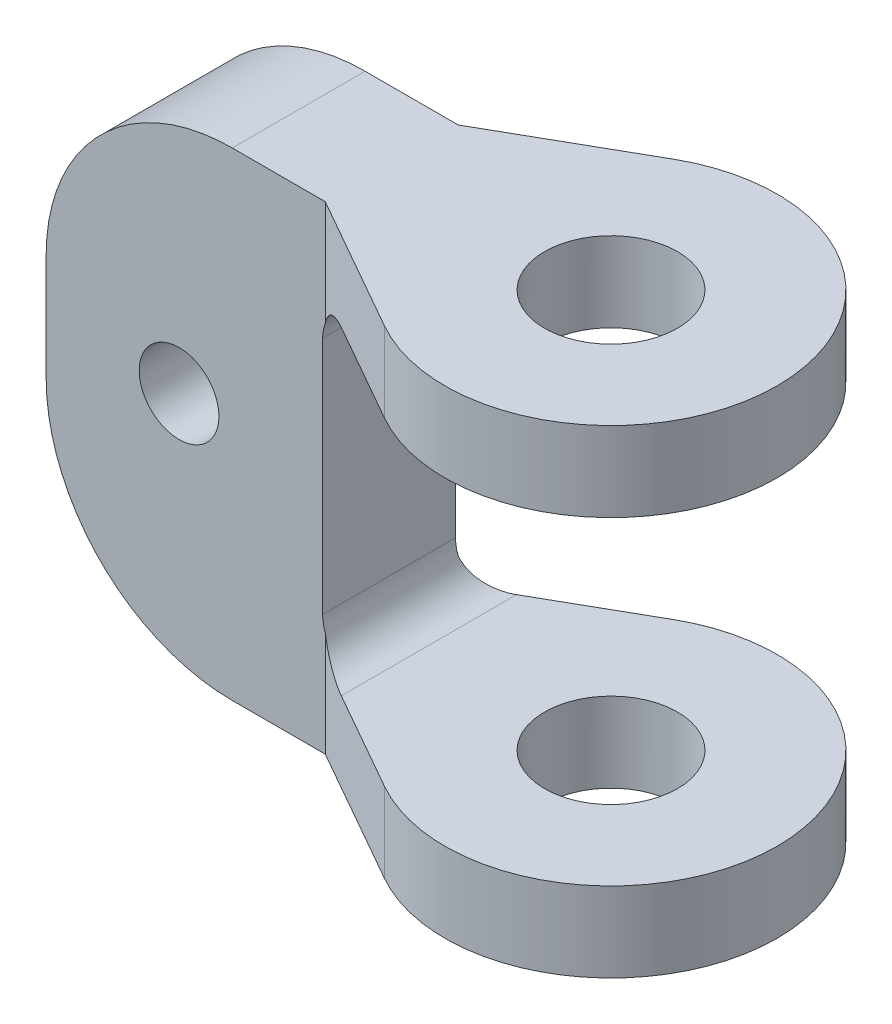
ISO-10303-21;
HEADER;
FILE_DESCRIPTION(('STEP AP214'),'2;1');
FILE_NAME('part.step','',(''),(''),'','','');
FILE_SCHEMA(('AUTOMOTIVE_DESIGN { 1 0 10303 214 1 1 1 1 }'));
ENDSEC;
DATA;
#1=APPLICATION_CONTEXT('core data for automotive mechanical design processes');
#2=APPLICATION_PROTOCOL_DEFINITION('international standard','automotive_design',2000,#1);
#3=PRODUCT_CONTEXT('',#1,'mechanical');
#4=PRODUCT('Part','Part','',(#3));
#5=PRODUCT_RELATED_PRODUCT_CATEGORY('part','',(#4));
#6=PRODUCT_DEFINITION_FORMATION('','',#4);
#7=PRODUCT_DEFINITION_CONTEXT('part definition',#1,'design');
#8=PRODUCT_DEFINITION('design','',#6,#7);
#9=PRODUCT_DEFINITION_SHAPE('','',#8);
#10=(LENGTH_UNIT() NAMED_UNIT(*) SI_UNIT(.MILLI.,.METRE.));
#11=(NAMED_UNIT(*) PLANE_ANGLE_UNIT() SI_UNIT($,.RADIAN.));
#12=(NAMED_UNIT(*) SI_UNIT($,.STERADIAN.) SOLID_ANGLE_UNIT());
#13=UNCERTAINTY_MEASURE_WITH_UNIT(LENGTH_MEASURE(1.E-05),#10,'distance_accuracy_value','');
#14=(GEOMETRIC_REPRESENTATION_CONTEXT(3) GLOBAL_UNCERTAINTY_ASSIGNED_CONTEXT((#13)) GLOBAL_UNIT_ASSIGNED_CONTEXT((#10,
#11,#12)) REPRESENTATION_CONTEXT('',''));
#15=CARTESIAN_POINT('',(0.,0.,0.));
#16=DIRECTION('',(0.,0.,1.));
#17=DIRECTION('',(1.,0.,0.));
#18=AXIS2_PLACEMENT_3D('',#15,#16,#17);
#19=CARTESIAN_POINT('',(-2.03740613183831,-4.9,3.58473693807711));
#20=DIRECTION('',(-0.494123766408109,0.,0.86939157085324));
#21=DIRECTION('',(0.86939157085324,0.,0.494123766408109));
#22=AXIS2_PLACEMENT_3D('',#19,#20,#21);
#23=PLANE('',#22);
#24=DIRECTION('',(-0.86939157085324,0.,-0.494123766408109));
#25=VECTOR('',#24,1.);
#26=CARTESIAN_POINT('',(22.3576398876919,2.1,17.449803526012));
#27=LINE('',#26,#25);
#28=CARTESIAN_POINT('',(14.4117264599493,2.1,12.9336973178328));
#29=VERTEX_POINT('',#28);
#30=CARTESIAN_POINT('',(10.65,2.1,10.7956981596825));
#31=VERTEX_POINT('',#30);
#32=EDGE_CURVE('E214',#29,#31,#27,.T.);
#33=ORIENTED_EDGE('',*,*,#32,.T.);
#34=CARTESIAN_POINT('',(10.65,3.6,10.7956981596825));
#35=DIRECTION('',(-0.494123766408109,0.,0.86939157085324));
#36=DIRECTION('',(-0.86939157085324,0.,-0.49412376640811));
#37=AXIS2_PLACEMENT_3D('',#34,#35,#36);
#38=ELLIPSE('',#37,1.72534454012231,1.5);
#39=CARTESIAN_POINT('',(9.24999999999999,3.06148351928658,10.));
#40=VERTEX_POINT('',#39);
#41=EDGE_CURVE('E268',#31,#40,#38,.F.);
#42=ORIENTED_EDGE('',*,*,#41,.T.);
#43=DIRECTION('',(0.,1.,0.));
#44=VECTOR('',#43,1.);
#45=CARTESIAN_POINT('',(9.24999999999999,-4.9,10.));
#46=LINE('',#45,#44);
#47=CARTESIAN_POINT('',(9.24999999999999,-0.9,10.));
#48=VERTEX_POINT('',#47);
#49=EDGE_CURVE('E198',#48,#40,#46,.T.);
#50=ORIENTED_EDGE('',*,*,#49,.F.);
#51=DIRECTION('',(0.86939157085324,0.,0.49412376640811));
#52=VECTOR('',#51,1.);
#53=CARTESIAN_POINT('',(12.9096185943086,-0.9,12.0799655575936));
#54=LINE('',#53,#52);
#55=CARTESIAN_POINT('',(14.4117264599493,-0.9,12.9336973178328));
#56=VERTEX_POINT('',#55);
#57=EDGE_CURVE('E217',#48,#56,#54,.T.);
#58=ORIENTED_EDGE('',*,*,#57,.T.);
#59=DIRECTION('',(0.,1.,0.));
#60=VECTOR('',#59,1.);
#61=CARTESIAN_POINT('',(14.4117264599493,-4.9,12.9336973178328));
#62=LINE('',#61,#60);
#63=EDGE_CURVE('E203',#56,#29,#62,.T.);
#64=ORIENTED_EDGE('',*,*,#63,.T.);
#65=EDGE_LOOP('',(#33,#42,#50,#58,#64));
#66=FACE_BOUND('',#65,.T.);
#67=ADVANCED_FACE('F33',(#66),#23,.T.);
#68=CARTESIAN_POINT('',(4.40639943026367,-4.9,7.75288861398288));
#69=DIRECTION('',(0.494123766408108,0.,0.869391570853241));
#70=DIRECTION('',(0.869391570853241,0.,-0.494123766408108));
#71=AXIS2_PLACEMENT_3D('',#68,#69,#70);
#72=PLANE('',#71);
#73=DIRECTION('',(0.,1.,0.));
#74=VECTOR('',#73,1.);
#75=CARTESIAN_POINT('',(9.25,-4.9,5.));
#76=LINE('',#75,#74);
#77=CARTESIAN_POINT('',(9.25,-0.9,5.));
#78=VERTEX_POINT('',#77);
#79=CARTESIAN_POINT('',(9.25,3.06148351928655,5.));
#80=VERTEX_POINT('',#79);
#81=EDGE_CURVE('E151',#78,#80,#76,.T.);
#82=ORIENTED_EDGE('',*,*,#81,.T.);
#83=CARTESIAN_POINT('',(10.65,3.6,4.20430184031755));
#84=DIRECTION('',(0.494123766408108,0.,0.869391570853241));
#85=DIRECTION('',(0.869391570853241,0.,-0.494123766408108));
#86=AXIS2_PLACEMENT_3D('',#83,#84,#85);
#87=ELLIPSE('',#86,1.72534454012231,1.5);
#88=CARTESIAN_POINT('',(10.65,2.1,4.20430184031756));
#89=VERTEX_POINT('',#88);
#90=EDGE_CURVE('E276',#80,#89,#87,.T.);
#91=ORIENTED_EDGE('',*,*,#90,.T.);
#92=DIRECTION('',(-0.869391570853241,0.,0.494123766408108));
#93=VECTOR('',#92,1.);
#94=CARTESIAN_POINT('',(15.91383432559,2.1,1.2125709219281));
#95=LINE('',#94,#93);
#96=CARTESIAN_POINT('',(14.4117264599493,2.1,2.06630268216725));
#97=VERTEX_POINT('',#96);
#98=EDGE_CURVE('E186',#97,#89,#95,.T.);
#99=ORIENTED_EDGE('',*,*,#98,.F.);
#100=DIRECTION('',(0.,1.,0.));
#101=VECTOR('',#100,1.);
#102=CARTESIAN_POINT('',(14.4117264599493,-4.9,2.06630268216725));
#103=LINE('',#102,#101);
#104=CARTESIAN_POINT('',(14.4117264599493,-0.9,2.06630268216725));
#105=VERTEX_POINT('',#104);
#106=EDGE_CURVE('E171',#105,#97,#103,.T.);
#107=ORIENTED_EDGE('',*,*,#106,.F.);
#108=DIRECTION('',(0.869391570853241,0.,-0.494123766408108));
#109=VECTOR('',#108,1.);
#110=CARTESIAN_POINT('',(6.46581303220668,-0.899999999999999,6.58240889034642));
#111=LINE('',#110,#109);
#112=EDGE_CURVE('E189',#78,#105,#111,.T.);
#113=ORIENTED_EDGE('',*,*,#112,.F.);
#114=EDGE_LOOP('',(#82,#91,#99,#107,#113));
#115=FACE_BOUND('',#114,.T.);
#116=ADVANCED_FACE('F338',(#115),#72,.F.);
#117=CARTESIAN_POINT('',(5.75000000000005,17.1,15.));
#118=DIRECTION('',(0.,-1.,0.));
#119=DIRECTION('',(0.,0.,-1.));
#120=AXIS2_PLACEMENT_3D('',#117,#118,#119);
#121=PLANE('',#120);
#122=CARTESIAN_POINT('',(17.5,17.1,7.5));
#123=DIRECTION('',(0.,-1.,0.));
#124=DIRECTION('',(0.,0.,-1.));
#125=AXIS2_PLACEMENT_3D('',#122,#123,#124);
#126=CIRCLE('',#125,2.5);
#127=CARTESIAN_POINT('',(17.5,17.1,5.));
#128=VERTEX_POINT('',#127);
#129=EDGE_CURVE('E235',#128,#128,#126,.F.);
#130=ORIENTED_EDGE('',*,*,#129,.F.);
#131=EDGE_LOOP('',(#130));
#132=FACE_BOUND('',#131,.T.);
#133=CARTESIAN_POINT('',(17.5,17.1,7.5));
#134=DIRECTION('',(0.,-1.,0.));
#135=DIRECTION('',(0.,0.,-1.));
#136=AXIS2_PLACEMENT_3D('',#133,#134,#135);
#137=CIRCLE('',#136,6.25);
#138=CARTESIAN_POINT('',(14.4117264599493,17.1,2.06630268216725));
#139=VERTEX_POINT('',#138);
#140=CARTESIAN_POINT('',(14.4117264599493,17.1,12.9336973178328));
#141=VERTEX_POINT('',#140);
#142=EDGE_CURVE('E165',#139,#141,#137,.T.);
#143=ORIENTED_EDGE('',*,*,#142,.F.);
#144=DIRECTION('',(0.869391570853241,0.,-0.494123766408108));
#145=VECTOR('',#144,1.);
#146=CARTESIAN_POINT('',(4.40639943026367,17.1,7.75288861398288));
#147=LINE('',#146,#145);
#148=CARTESIAN_POINT('',(9.25,17.1,5.));
#149=VERTEX_POINT('',#148);
#150=EDGE_CURVE('E148',#149,#139,#147,.T.);
#151=ORIENTED_EDGE('',*,*,#150,.F.);
#152=DIRECTION('',(1.,0.,0.));
#153=VECTOR('',#152,1.);
#154=CARTESIAN_POINT('',(0.,17.1,5.));
#155=LINE('',#154,#153);
#156=CARTESIAN_POINT('',(5.75,17.1,5.));
#157=VERTEX_POINT('',#156);
#158=EDGE_CURVE('E154',#157,#149,#155,.T.);
#159=ORIENTED_EDGE('',*,*,#158,.F.);
#160=DIRECTION('',(0.,0.,-1.));
#161=VECTOR('',#160,1.);
#162=CARTESIAN_POINT('',(5.75000000000005,17.1,15.));
#163=LINE('',#162,#161);
#164=CARTESIAN_POINT('',(5.75,17.1,10.));
#165=VERTEX_POINT('',#164);
#166=EDGE_CURVE('E247',#165,#157,#163,.T.);
#167=ORIENTED_EDGE('',*,*,#166,.F.);
#168=DIRECTION('',(1.,0.,0.));
#169=VECTOR('',#168,1.);
#170=CARTESIAN_POINT('',(0.,17.1,10.));
#171=LINE('',#170,#169);
#172=CARTESIAN_POINT('',(9.24999999999999,17.1,10.));
#173=VERTEX_POINT('',#172);
#174=EDGE_CURVE('E194',#165,#173,#171,.T.);
#175=ORIENTED_EDGE('',*,*,#174,.T.);
#176=DIRECTION('',(0.86939157085324,0.,0.494123766408109));
#177=VECTOR('',#176,1.);
#178=CARTESIAN_POINT('',(-2.03740613183831,17.1,3.58473693807711));
#179=LINE('',#178,#177);
#180=EDGE_CURVE('E192',#173,#141,#179,.T.);
#181=ORIENTED_EDGE('',*,*,#180,.T.);
#182=EDGE_LOOP('',(#143,#151,#159,#167,#175,#181));
#183=FACE_BOUND('',#182,.T.);
#184=ADVANCED_FACE('F163',(#132,#183),#121,.F.);
#185=CARTESIAN_POINT('',(11.25,-0.9,15.));
#186=DIRECTION('',(0.,1.,0.));
#187=DIRECTION('',(-1.,0.,0.));
#188=AXIS2_PLACEMENT_3D('',#185,#186,#187);
#189=PLANE('',#188);
#190=CARTESIAN_POINT('',(17.5,-0.900000000000001,7.5));
#191=DIRECTION('',(0.,1.,0.));
#192=DIRECTION('',(-1.,0.,0.));
#193=AXIS2_PLACEMENT_3D('',#190,#191,#192);
#194=CIRCLE('',#193,2.5);
#195=CARTESIAN_POINT('',(15.,-0.900000000000001,7.5));
#196=VERTEX_POINT('',#195);
#197=EDGE_CURVE('E232',#196,#196,#194,.F.);
#198=ORIENTED_EDGE('',*,*,#197,.F.);
#199=EDGE_LOOP('',(#198));
#200=FACE_BOUND('',#199,.T.);
#201=ORIENTED_EDGE('',*,*,#112,.T.);
#202=CARTESIAN_POINT('',(17.5,-0.900000000000001,7.5));
#203=DIRECTION('',(0.,1.,0.));
#204=DIRECTION('',(-1.,0.,0.));
#205=AXIS2_PLACEMENT_3D('',#202,#203,#204);
#206=CIRCLE('',#205,6.25);
#207=EDGE_CURVE('E224',#56,#105,#206,.T.);
#208=ORIENTED_EDGE('',*,*,#207,.F.);
#209=ORIENTED_EDGE('',*,*,#57,.F.);
#210=DIRECTION('',(1.,0.,0.));
#211=VECTOR('',#210,1.);
#212=CARTESIAN_POINT('',(11.25,-0.9,10.));
#213=LINE('',#212,#211);
#214=CARTESIAN_POINT('',(5.75000000000005,-0.9,10.));
#215=VERTEX_POINT('',#214);
#216=EDGE_CURVE('E210',#215,#48,#213,.T.);
#217=ORIENTED_EDGE('',*,*,#216,.F.);
#218=DIRECTION('',(0.,0.,-1.));
#219=VECTOR('',#218,1.);
#220=CARTESIAN_POINT('',(5.75000000000005,-0.9,15.));
#221=LINE('',#220,#219);
#222=CARTESIAN_POINT('',(5.75000000000005,-0.9,5.));
#223=VERTEX_POINT('',#222);
#224=EDGE_CURVE('E238',#215,#223,#221,.T.);
#225=ORIENTED_EDGE('',*,*,#224,.T.);
#226=DIRECTION('',(1.,0.,0.));
#227=VECTOR('',#226,1.);
#228=CARTESIAN_POINT('',(11.25,-0.9,5.));
#229=LINE('',#228,#227);
#230=EDGE_CURVE('E181',#223,#78,#229,.T.);
#231=ORIENTED_EDGE('',*,*,#230,.T.);
#232=EDGE_LOOP('',(#201,#208,#209,#217,#225,#231));
#233=FACE_BOUND('',#232,.T.);
#234=ADVANCED_FACE('F306',(#200,#233),#189,.F.);
#235=CARTESIAN_POINT('',(23.75,2.1,15.));
#236=DIRECTION('',(0.,-1.,0.));
#237=DIRECTION('',(1.,0.,0.));
#238=AXIS2_PLACEMENT_3D('',#235,#236,#237);
#239=PLANE('',#238);
#240=CARTESIAN_POINT('',(17.5,2.1,7.5));
#241=DIRECTION('',(0.,-1.,0.));
#242=DIRECTION('',(1.,0.,0.));
#243=AXIS2_PLACEMENT_3D('',#240,#241,#242);
#244=CIRCLE('',#243,2.5);
#245=CARTESIAN_POINT('',(20.,2.1,7.5));
#246=VERTEX_POINT('',#245);
#247=EDGE_CURVE('E229',#246,#246,#244,.F.);
#248=ORIENTED_EDGE('',*,*,#247,.F.);
#249=EDGE_LOOP('',(#248));
#250=FACE_BOUND('',#249,.T.);
#251=ORIENTED_EDGE('',*,*,#98,.T.);
#252=DIRECTION('',(0.,0.,1.));
#253=VECTOR('',#252,1.);
#254=CARTESIAN_POINT('',(10.65,2.1,10.));
#255=LINE('',#254,#253);
#256=EDGE_CURVE('E258',#89,#31,#255,.T.);
#257=ORIENTED_EDGE('',*,*,#256,.T.);
#258=ORIENTED_EDGE('',*,*,#32,.F.);
#259=CARTESIAN_POINT('',(17.5,2.1,7.5));
#260=DIRECTION('',(0.,-1.,0.));
#261=DIRECTION('',(1.,0.,0.));
#262=AXIS2_PLACEMENT_3D('',#259,#260,#261);
#263=CIRCLE('',#262,6.25);
#264=EDGE_CURVE('E220',#97,#29,#263,.T.);
#265=ORIENTED_EDGE('',*,*,#264,.F.);
#266=EDGE_LOOP('',(#251,#257,#258,#265));
#267=FACE_BOUND('',#266,.T.);
#268=ADVANCED_FACE('F371',(#250,#267),#239,.F.);
#269=CARTESIAN_POINT('',(23.75,14.1,15.));
#270=DIRECTION('',(0.,1.,0.));
#271=DIRECTION('',(-1.,0.,0.));
#272=AXIS2_PLACEMENT_3D('',#269,#270,#271);
#273=PLANE('',#272);
#274=CARTESIAN_POINT('',(17.5,14.1,7.5));
#275=DIRECTION('',(0.,1.,0.));
#276=DIRECTION('',(-1.,0.,0.));
#277=AXIS2_PLACEMENT_3D('',#274,#275,#276);
#278=CIRCLE('',#277,2.5);
#279=CARTESIAN_POINT('',(15.,14.1,7.5));
#280=VERTEX_POINT('',#279);
#281=EDGE_CURVE('E226',#280,#280,#278,.F.);
#282=ORIENTED_EDGE('',*,*,#281,.F.);
#283=EDGE_LOOP('',(#282));
#284=FACE_BOUND('',#283,.T.);
#285=DIRECTION('',(0.86939157085324,0.,0.494123766408109));
#286=VECTOR('',#285,1.);
#287=CARTESIAN_POINT('',(22.3576398876919,14.1,17.449803526012));
#288=LINE('',#287,#286);
#289=CARTESIAN_POINT('',(10.65,14.1,10.7956981596825));
#290=VERTEX_POINT('',#289);
#291=CARTESIAN_POINT('',(14.4117264599493,14.1,12.9336973178328));
#292=VERTEX_POINT('',#291);
#293=EDGE_CURVE('E212',#290,#292,#288,.T.);
#294=ORIENTED_EDGE('',*,*,#293,.F.);
#295=DIRECTION('',(0.,0.,1.));
#296=VECTOR('',#295,1.);
#297=CARTESIAN_POINT('',(10.65,14.1,5.));
#298=LINE('',#297,#296);
#299=CARTESIAN_POINT('',(10.65,14.1,4.20430184031756));
#300=VERTEX_POINT('',#299);
#301=EDGE_CURVE('E266',#290,#300,#298,.F.);
#302=ORIENTED_EDGE('',*,*,#301,.T.);
#303=DIRECTION('',(0.869391570853241,0.,-0.494123766408108));
#304=VECTOR('',#303,1.);
#305=CARTESIAN_POINT('',(15.91383432559,14.1,1.2125709219281));
#306=LINE('',#305,#304);
#307=CARTESIAN_POINT('',(14.4117264599493,14.1,2.06630268216725));
#308=VERTEX_POINT('',#307);
#309=EDGE_CURVE('E184',#300,#308,#306,.T.);
#310=ORIENTED_EDGE('',*,*,#309,.T.);
#311=CARTESIAN_POINT('',(17.5,14.1,7.5));
#312=DIRECTION('',(0.,1.,0.));
#313=DIRECTION('',(-1.,0.,0.));
#314=AXIS2_PLACEMENT_3D('',#311,#312,#313);
#315=CIRCLE('',#314,6.25);
#316=EDGE_CURVE('E221',#292,#308,#315,.T.);
#317=ORIENTED_EDGE('',*,*,#316,.F.);
#318=EDGE_LOOP('',(#294,#302,#310,#317));
#319=FACE_BOUND('',#318,.T.);
#320=ADVANCED_FACE('F288',(#284,#319),#273,.F.);
#321=CARTESIAN_POINT('',(5.75,10.1,15.));
#322=DIRECTION('',(0.,0.,-1.));
#323=DIRECTION('',(-1.,0.,0.));
#324=AXIS2_PLACEMENT_3D('',#321,#322,#323);
#325=CYLINDRICAL_SURFACE('',#324,7.);
#326=ORIENTED_EDGE('',*,*,#166,.T.);
#327=CARTESIAN_POINT('',(5.75,10.1,5.));
#328=DIRECTION('',(0.,0.,1.));
#329=DIRECTION('',(1.,0.,0.));
#330=AXIS2_PLACEMENT_3D('',#327,#328,#329);
#331=CIRCLE('',#330,7.);
#332=CARTESIAN_POINT('',(-1.25,10.1,5.));
#333=VERTEX_POINT('',#332);
#334=EDGE_CURVE('E157',#157,#333,#331,.T.);
#335=ORIENTED_EDGE('',*,*,#334,.T.);
#336=DIRECTION('',(0.,0.,-1.));
#337=VECTOR('',#336,1.);
#338=CARTESIAN_POINT('',(-1.25,10.1,15.));
#339=LINE('',#338,#337);
#340=CARTESIAN_POINT('',(-1.25,10.1,10.));
#341=VERTEX_POINT('',#340);
#342=EDGE_CURVE('E244',#341,#333,#339,.T.);
#343=ORIENTED_EDGE('',*,*,#342,.F.);
#344=CARTESIAN_POINT('',(5.75,10.1,10.));
#345=DIRECTION('',(0.,0.,1.));
#346=DIRECTION('',(1.,0.,0.));
#347=AXIS2_PLACEMENT_3D('',#344,#345,#346);
#348=CIRCLE('',#347,7.);
#349=EDGE_CURVE('E208',#165,#341,#348,.T.);
#350=ORIENTED_EDGE('',*,*,#349,.F.);
#351=EDGE_LOOP('',(#326,#335,#343,#350));
#352=FACE_BOUND('',#351,.T.);
#353=ADVANCED_FACE('F320',(#352),#325,.T.);
#354=CARTESIAN_POINT('',(-1.25,6.10000000000005,15.));
#355=DIRECTION('',(1.,0.,0.));
#356=DIRECTION('',(0.,0.,-1.));
#357=AXIS2_PLACEMENT_3D('',#354,#355,#356);
#358=PLANE('',#357);
#359=ORIENTED_EDGE('',*,*,#342,.T.);
#360=DIRECTION('',(0.,-1.,0.));
#361=VECTOR('',#360,1.);
#362=CARTESIAN_POINT('',(-1.25,6.10000000000005,5.));
#363=LINE('',#362,#361);
#364=CARTESIAN_POINT('',(-1.25,6.10000000000005,5.));
#365=VERTEX_POINT('',#364);
#366=EDGE_CURVE('E176',#333,#365,#363,.T.);
#367=ORIENTED_EDGE('',*,*,#366,.T.);
#368=DIRECTION('',(0.,0.,-1.));
#369=VECTOR('',#368,1.);
#370=CARTESIAN_POINT('',(-1.25,6.10000000000005,15.));
#371=LINE('',#370,#369);
#372=CARTESIAN_POINT('',(-1.25,6.10000000000005,10.));
#373=VERTEX_POINT('',#372);
#374=EDGE_CURVE('E241',#373,#365,#371,.T.);
#375=ORIENTED_EDGE('',*,*,#374,.F.);
#376=DIRECTION('',(0.,-1.,0.));
#377=VECTOR('',#376,1.);
#378=CARTESIAN_POINT('',(-1.25,6.10000000000005,10.));
#379=LINE('',#378,#377);
#380=EDGE_CURVE('E206',#341,#373,#379,.T.);
#381=ORIENTED_EDGE('',*,*,#380,.F.);
#382=EDGE_LOOP('',(#359,#367,#375,#381));
#383=FACE_BOUND('',#382,.T.);
#384=ADVANCED_FACE('F315',(#383),#358,.F.);
#385=CARTESIAN_POINT('',(5.75,6.1,15.));
#386=DIRECTION('',(0.,0.,-1.));
#387=DIRECTION('',(-1.,0.,0.));
#388=AXIS2_PLACEMENT_3D('',#385,#386,#387);
#389=CYLINDRICAL_SURFACE('',#388,7.);
#390=ORIENTED_EDGE('',*,*,#374,.T.);
#391=CARTESIAN_POINT('',(5.75,6.1,5.));
#392=DIRECTION('',(0.,0.,1.));
#393=DIRECTION('',(1.,0.,0.));
#394=AXIS2_PLACEMENT_3D('',#391,#392,#393);
#395=CIRCLE('',#394,7.);
#396=EDGE_CURVE('E173',#365,#223,#395,.T.);
#397=ORIENTED_EDGE('',*,*,#396,.T.);
#398=ORIENTED_EDGE('',*,*,#224,.F.);
#399=CARTESIAN_POINT('',(5.75,6.1,10.));
#400=DIRECTION('',(0.,0.,1.));
#401=DIRECTION('',(1.,0.,0.));
#402=AXIS2_PLACEMENT_3D('',#399,#400,#401);
#403=CIRCLE('',#402,7.);
#404=EDGE_CURVE('E204',#373,#215,#403,.T.);
#405=ORIENTED_EDGE('',*,*,#404,.F.);
#406=EDGE_LOOP('',(#390,#397,#398,#405));
#407=FACE_BOUND('',#406,.T.);
#408=ADVANCED_FACE('F312',(#407),#389,.T.);
#409=CARTESIAN_POINT('',(3.75,8.1,15.));
#410=DIRECTION('',(0.,0.,-1.));
#411=DIRECTION('',(-1.,0.,0.));
#412=AXIS2_PLACEMENT_3D('',#409,#410,#411);
#413=CYLINDRICAL_SURFACE('',#412,1.5);
#414=CARTESIAN_POINT('',(3.75,8.1,5.));
#415=DIRECTION('',(0.,0.,1.));
#416=DIRECTION('',(1.,0.,0.));
#417=AXIS2_PLACEMENT_3D('',#414,#415,#416);
#418=CIRCLE('',#417,1.5);
#419=CARTESIAN_POINT('',(5.25,8.1,5.));
#420=VERTEX_POINT('',#419);
#421=EDGE_CURVE('E177',#420,#420,#418,.T.);
#422=ORIENTED_EDGE('',*,*,#421,.F.);
#423=EDGE_LOOP('',(#422));
#424=FACE_BOUND('',#423,.T.);
#425=CARTESIAN_POINT('',(3.75,8.1,10.));
#426=DIRECTION('',(0.,0.,1.));
#427=DIRECTION('',(1.,0.,0.));
#428=AXIS2_PLACEMENT_3D('',#425,#426,#427);
#429=CIRCLE('',#428,1.5);
#430=CARTESIAN_POINT('',(5.25,8.1,10.));
#431=VERTEX_POINT('',#430);
#432=EDGE_CURVE('E200',#431,#431,#429,.T.);
#433=ORIENTED_EDGE('',*,*,#432,.T.);
#434=EDGE_LOOP('',(#433));
#435=FACE_BOUND('',#434,.T.);
#436=ADVANCED_FACE('F368',(#424,#435),#413,.F.);
#437=CARTESIAN_POINT('',(17.5,20.,7.5));
#438=DIRECTION('',(0.,-1.,0.));
#439=DIRECTION('',(0.,0.,-1.));
#440=AXIS2_PLACEMENT_3D('',#437,#438,#439);
#441=CYLINDRICAL_SURFACE('',#440,2.5);
#442=ORIENTED_EDGE('',*,*,#281,.T.);
#443=EDGE_LOOP('',(#442));
#444=FACE_BOUND('',#443,.T.);
#445=ORIENTED_EDGE('',*,*,#129,.T.);
#446=EDGE_LOOP('',(#445));
#447=FACE_BOUND('',#446,.T.);
#448=ADVANCED_FACE('F380',(#444,#447),#441,.F.);
#449=ORIENTED_EDGE('',*,*,#247,.T.);
#450=EDGE_LOOP('',(#449));
#451=FACE_BOUND('',#450,.T.);
#452=ORIENTED_EDGE('',*,*,#197,.T.);
#453=EDGE_LOOP('',(#452));
#454=FACE_BOUND('',#453,.T.);
#455=ADVANCED_FACE('F334',(#451,#454),#441,.F.);
#456=CARTESIAN_POINT('',(17.5,20.,7.5));
#457=DIRECTION('',(0.,-1.,0.));
#458=DIRECTION('',(0.,0.,-1.));
#459=AXIS2_PLACEMENT_3D('',#456,#457,#458);
#460=CYLINDRICAL_SURFACE('',#459,6.25);
#461=ORIENTED_EDGE('',*,*,#207,.T.);
#462=ORIENTED_EDGE('',*,*,#106,.T.);
#463=ORIENTED_EDGE('',*,*,#264,.T.);
#464=ORIENTED_EDGE('',*,*,#63,.F.);
#465=EDGE_LOOP('',(#461,#462,#463,#464));
#466=FACE_BOUND('',#465,.T.);
#467=ADVANCED_FACE('F327',(#466),#460,.T.);
#468=ORIENTED_EDGE('',*,*,#142,.T.);
#469=EDGE_CURVE('E197',#292,#141,#62,.T.);
#470=ORIENTED_EDGE('',*,*,#469,.F.);
#471=ORIENTED_EDGE('',*,*,#316,.T.);
#472=EDGE_CURVE('E170',#308,#139,#103,.T.);
#473=ORIENTED_EDGE('',*,*,#472,.T.);
#474=EDGE_LOOP('',(#468,#470,#471,#473));
#475=FACE_BOUND('',#474,.T.);
#476=ADVANCED_FACE('F325',(#475),#460,.T.);
#477=CARTESIAN_POINT('',(9.24999999999999,13.1385164807134,10.));
#478=VERTEX_POINT('',#477);
#479=EDGE_CURVE('E55',#478,#173,#46,.T.);
#480=ORIENTED_EDGE('',*,*,#479,.F.);
#481=CARTESIAN_POINT('',(10.65,12.6,10.7956981596825));
#482=DIRECTION('',(-0.494123766408109,0.,0.86939157085324));
#483=DIRECTION('',(-0.86939157085324,0.,-0.49412376640811));
#484=AXIS2_PLACEMENT_3D('',#481,#482,#483);
#485=ELLIPSE('',#484,1.72534454012231,1.5);
#486=EDGE_CURVE('E280',#478,#290,#485,.F.);
#487=ORIENTED_EDGE('',*,*,#486,.T.);
#488=ORIENTED_EDGE('',*,*,#293,.T.);
#489=ORIENTED_EDGE('',*,*,#469,.T.);
#490=ORIENTED_EDGE('',*,*,#180,.F.);
#491=EDGE_LOOP('',(#480,#487,#488,#489,#490));
#492=FACE_BOUND('',#491,.T.);
#493=ADVANCED_FACE('F283',(#492),#23,.T.);
#494=CARTESIAN_POINT('',(0.,-4.9,10.));
#495=DIRECTION('',(0.,0.,1.));
#496=DIRECTION('',(1.,0.,0.));
#497=AXIS2_PLACEMENT_3D('',#494,#495,#496);
#498=PLANE('',#497);
#499=ORIENTED_EDGE('',*,*,#49,.T.);
#500=CARTESIAN_POINT('',(10.65,3.6,10.));
#501=DIRECTION('',(0.,0.,1.));
#502=DIRECTION('',(1.,0.,0.));
#503=AXIS2_PLACEMENT_3D('',#500,#501,#502);
#504=CIRCLE('',#503,1.5);
#505=CARTESIAN_POINT('',(9.15,3.6,10.));
#506=VERTEX_POINT('',#505);
#507=EDGE_CURVE('E271',#40,#506,#504,.F.);
#508=ORIENTED_EDGE('',*,*,#507,.T.);
#509=DIRECTION('',(0.,-1.,0.));
#510=VECTOR('',#509,1.);
#511=CARTESIAN_POINT('',(9.15,-4.9,10.));
#512=LINE('',#511,#510);
#513=CARTESIAN_POINT('',(9.15,12.6,10.));
#514=VERTEX_POINT('',#513);
#515=EDGE_CURVE('E161',#514,#506,#512,.T.);
#516=ORIENTED_EDGE('',*,*,#515,.F.);
#517=CARTESIAN_POINT('',(10.65,12.6,10.));
#518=DIRECTION('',(0.,0.,1.));
#519=DIRECTION('',(1.,0.,0.));
#520=AXIS2_PLACEMENT_3D('',#517,#518,#519);
#521=CIRCLE('',#520,1.5);
#522=EDGE_CURVE('E278',#514,#478,#521,.F.);
#523=ORIENTED_EDGE('',*,*,#522,.T.);
#524=ORIENTED_EDGE('',*,*,#479,.T.);
#525=ORIENTED_EDGE('',*,*,#174,.F.);
#526=ORIENTED_EDGE('',*,*,#349,.T.);
#527=ORIENTED_EDGE('',*,*,#380,.T.);
#528=ORIENTED_EDGE('',*,*,#404,.T.);
#529=ORIENTED_EDGE('',*,*,#216,.T.);
#530=EDGE_LOOP('',(#499,#508,#516,#523,#524,#525,#526,#527,#528,#529));
#531=FACE_BOUND('',#530,.T.);
#532=ORIENTED_EDGE('',*,*,#432,.F.);
#533=EDGE_LOOP('',(#532));
#534=FACE_BOUND('',#533,.T.);
#535=ADVANCED_FACE('F322',(#531,#534),#498,.T.);
#536=ORIENTED_EDGE('',*,*,#309,.F.);
#537=CARTESIAN_POINT('',(10.65,12.6,4.20430184031756));
#538=DIRECTION('',(0.494123766408108,0.,0.869391570853241));
#539=DIRECTION('',(0.869391570853241,0.,-0.494123766408108));
#540=AXIS2_PLACEMENT_3D('',#537,#538,#539);
#541=ELLIPSE('',#540,1.72534454012231,1.5);
#542=CARTESIAN_POINT('',(9.25,13.1385164807135,5.));
#543=VERTEX_POINT('',#542);
#544=EDGE_CURVE('E41',#300,#543,#541,.T.);
#545=ORIENTED_EDGE('',*,*,#544,.T.);
#546=EDGE_CURVE('E47',#543,#149,#76,.T.);
#547=ORIENTED_EDGE('',*,*,#546,.T.);
#548=ORIENTED_EDGE('',*,*,#150,.T.);
#549=ORIENTED_EDGE('',*,*,#472,.F.);
#550=EDGE_LOOP('',(#536,#545,#547,#548,#549));
#551=FACE_BOUND('',#550,.T.);
#552=ADVANCED_FACE('F145',(#551),#72,.F.);
#553=CARTESIAN_POINT('',(0.,-4.9,5.));
#554=DIRECTION('',(0.,0.,1.));
#555=DIRECTION('',(1.,0.,0.));
#556=AXIS2_PLACEMENT_3D('',#553,#554,#555);
#557=PLANE('',#556);
#558=ORIENTED_EDGE('',*,*,#421,.T.);
#559=EDGE_LOOP('',(#558));
#560=FACE_BOUND('',#559,.T.);
#561=ORIENTED_EDGE('',*,*,#546,.F.);
#562=CARTESIAN_POINT('',(10.65,12.6,5.));
#563=DIRECTION('',(0.,0.,1.));
#564=DIRECTION('',(1.,0.,0.));
#565=AXIS2_PLACEMENT_3D('',#562,#563,#564);
#566=CIRCLE('',#565,1.5);
#567=CARTESIAN_POINT('',(9.15,12.6,5.));
#568=VERTEX_POINT('',#567);
#569=EDGE_CURVE('E11',#543,#568,#566,.T.);
#570=ORIENTED_EDGE('',*,*,#569,.T.);
#571=DIRECTION('',(0.,-1.,0.));
#572=VECTOR('',#571,1.);
#573=CARTESIAN_POINT('',(9.15,-4.9,5.));
#574=LINE('',#573,#572);
#575=CARTESIAN_POINT('',(9.15,3.6,5.));
#576=VERTEX_POINT('',#575);
#577=EDGE_CURVE('E249',#568,#576,#574,.T.);
#578=ORIENTED_EDGE('',*,*,#577,.T.);
#579=CARTESIAN_POINT('',(10.65,3.6,5.));
#580=DIRECTION('',(0.,0.,1.));
#581=DIRECTION('',(1.,0.,0.));
#582=AXIS2_PLACEMENT_3D('',#579,#580,#581);
#583=CIRCLE('',#582,1.5);
#584=EDGE_CURVE('E273',#576,#80,#583,.T.);
#585=ORIENTED_EDGE('',*,*,#584,.T.);
#586=ORIENTED_EDGE('',*,*,#81,.F.);
#587=ORIENTED_EDGE('',*,*,#230,.F.);
#588=ORIENTED_EDGE('',*,*,#396,.F.);
#589=ORIENTED_EDGE('',*,*,#366,.F.);
#590=ORIENTED_EDGE('',*,*,#334,.F.);
#591=ORIENTED_EDGE('',*,*,#158,.T.);
#592=EDGE_LOOP('',(#561,#570,#578,#585,#586,#587,#588,#589,#590,#591));
#593=FACE_BOUND('',#592,.T.);
#594=ADVANCED_FACE('F155',(#560,#593),#557,.F.);
#595=CARTESIAN_POINT('',(9.15,14.1,0.));
#596=DIRECTION('',(-1.,0.,0.));
#597=DIRECTION('',(0.,-1.,0.));
#598=AXIS2_PLACEMENT_3D('',#595,#596,#597);
#599=PLANE('',#598);
#600=ORIENTED_EDGE('',*,*,#515,.T.);
#601=DIRECTION('',(0.,0.,1.));
#602=VECTOR('',#601,1.);
#603=CARTESIAN_POINT('',(9.15,3.6,5.));
#604=LINE('',#603,#602);
#605=EDGE_CURVE('E264',#506,#576,#604,.F.);
#606=ORIENTED_EDGE('',*,*,#605,.T.);
#607=ORIENTED_EDGE('',*,*,#577,.F.);
#608=DIRECTION('',(0.,0.,1.));
#609=VECTOR('',#608,1.);
#610=CARTESIAN_POINT('',(9.15,12.6,10.));
#611=LINE('',#610,#609);
#612=EDGE_CURVE('E261',#568,#514,#611,.T.);
#613=ORIENTED_EDGE('',*,*,#612,.T.);
#614=EDGE_LOOP('',(#600,#606,#607,#613));
#615=FACE_BOUND('',#614,.T.);
#616=ADVANCED_FACE('F295',(#615),#599,.F.);
#617=CARTESIAN_POINT('',(10.65,3.6,15.));
#618=DIRECTION('',(0.,0.,-1.));
#619=DIRECTION('',(-1.,0.,0.));
#620=AXIS2_PLACEMENT_3D('',#617,#618,#619);
#621=CYLINDRICAL_SURFACE('',#620,1.5);
#622=ORIENTED_EDGE('',*,*,#584,.F.);
#623=ORIENTED_EDGE('',*,*,#605,.F.);
#624=ORIENTED_EDGE('',*,*,#507,.F.);
#625=ORIENTED_EDGE('',*,*,#41,.F.);
#626=ORIENTED_EDGE('',*,*,#256,.F.);
#627=ORIENTED_EDGE('',*,*,#90,.F.);
#628=EDGE_LOOP('',(#622,#623,#624,#625,#626,#627));
#629=FACE_BOUND('',#628,.T.);
#630=ADVANCED_FACE('F300',(#629),#621,.F.);
#631=CARTESIAN_POINT('',(10.65,12.6,0.));
#632=DIRECTION('',(0.,0.,-1.));
#633=DIRECTION('',(-1.,0.,0.));
#634=AXIS2_PLACEMENT_3D('',#631,#632,#633);
#635=CYLINDRICAL_SURFACE('',#634,1.5);
#636=ORIENTED_EDGE('',*,*,#544,.F.);
#637=ORIENTED_EDGE('',*,*,#301,.F.);
#638=ORIENTED_EDGE('',*,*,#486,.F.);
#639=ORIENTED_EDGE('',*,*,#522,.F.);
#640=ORIENTED_EDGE('',*,*,#612,.F.);
#641=ORIENTED_EDGE('',*,*,#569,.F.);
#642=EDGE_LOOP('',(#636,#637,#638,#639,#640,#641));
#643=FACE_BOUND('',#642,.T.);
#644=ADVANCED_FACE('F35',(#643),#635,.F.);
#645=CLOSED_SHELL('',(#67,#116,#184,#234,#268,#320,#353,#384,#408,#436,#448,#455,#467,#476,#493,
#535,#552,#594,#616,#630,#644));
#646=MANIFOLD_SOLID_BREP('B2',#645);
#647=ADVANCED_BREP_SHAPE_REPRESENTATION('',(#18,#646),#14);
#648=SHAPE_DEFINITION_REPRESENTATION(#9,#647);
ENDSEC;
END-ISO-10303-21;
